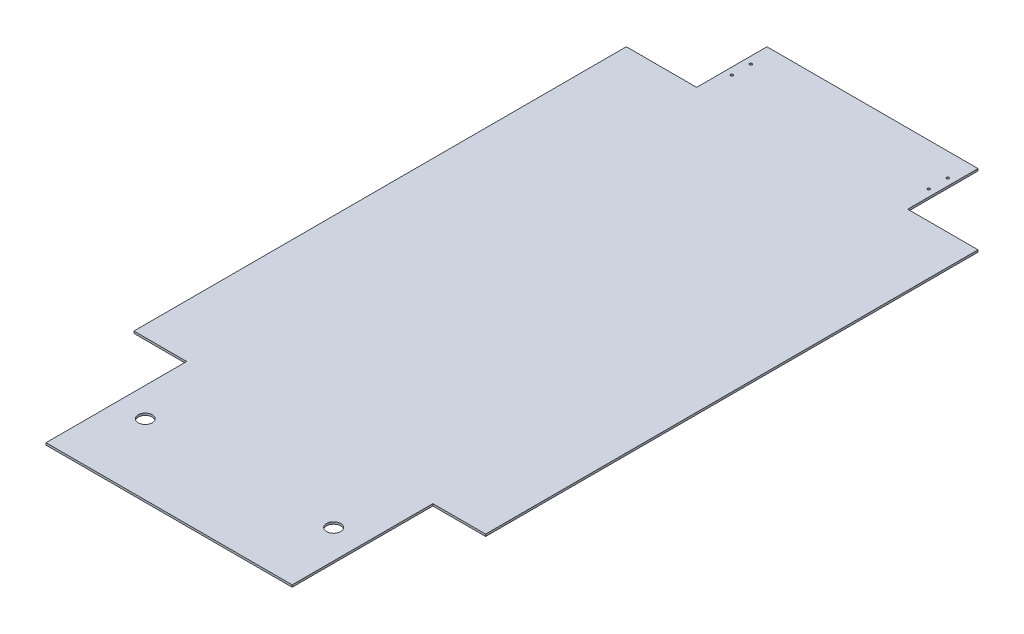
ISO-10303-21;
HEADER;
FILE_DESCRIPTION(('STEP AP214'),'2;1');
FILE_NAME('part.step','',(''),(''),'','','');
FILE_SCHEMA(('AUTOMOTIVE_DESIGN { 1 0 10303 214 1 1 1 1 }'));
ENDSEC;
DATA;
#1=APPLICATION_CONTEXT('core data for automotive mechanical design processes');
#2=APPLICATION_PROTOCOL_DEFINITION('international standard','automotive_design',2000,#1);
#3=PRODUCT_CONTEXT('',#1,'mechanical');
#4=PRODUCT('Part','Part','',(#3));
#5=PRODUCT_RELATED_PRODUCT_CATEGORY('part','',(#4));
#6=PRODUCT_DEFINITION_FORMATION('','',#4);
#7=PRODUCT_DEFINITION_CONTEXT('part definition',#1,'design');
#8=PRODUCT_DEFINITION('design','',#6,#7);
#9=PRODUCT_DEFINITION_SHAPE('','',#8);
#10=(LENGTH_UNIT() NAMED_UNIT(*) SI_UNIT(.MILLI.,.METRE.));
#11=(NAMED_UNIT(*) PLANE_ANGLE_UNIT() SI_UNIT($,.RADIAN.));
#12=(NAMED_UNIT(*) SI_UNIT($,.STERADIAN.) SOLID_ANGLE_UNIT());
#13=UNCERTAINTY_MEASURE_WITH_UNIT(LENGTH_MEASURE(1.E-05),#10,'distance_accuracy_value','');
#14=(GEOMETRIC_REPRESENTATION_CONTEXT(3) GLOBAL_UNCERTAINTY_ASSIGNED_CONTEXT((#13)) GLOBAL_UNIT_ASSIGNED_CONTEXT((#10,
#11,#12)) REPRESENTATION_CONTEXT('',''));
#15=CARTESIAN_POINT('',(0.,0.,0.));
#16=DIRECTION('',(0.,0.,1.));
#17=DIRECTION('',(1.,0.,0.));
#18=AXIS2_PLACEMENT_3D('',#15,#16,#17);
#19=CARTESIAN_POINT('',(0.,3.,0.));
#20=DIRECTION('',(0.,-1.,0.));
#21=DIRECTION('',(0.,0.,-1.));
#22=AXIS2_PLACEMENT_3D('',#19,#20,#21);
#23=PLANE('',#22);
#24=DIRECTION('',(1.,0.,0.));
#25=VECTOR('',#24,1.);
#26=CARTESIAN_POINT('',(-175.,3.,300.));
#27=LINE('',#26,#25);
#28=CARTESIAN_POINT('',(-250.,3.,300.));
#29=VERTEX_POINT('',#28);
#30=CARTESIAN_POINT('',(-175.,3.,300.));
#31=VERTEX_POINT('',#30);
#32=EDGE_CURVE('E179',#29,#31,#27,.T.);
#33=ORIENTED_EDGE('',*,*,#32,.T.);
#34=DIRECTION('',(0.,0.,1.));
#35=VECTOR('',#34,1.);
#36=CARTESIAN_POINT('',(-175.,3.,500.));
#37=LINE('',#36,#35);
#38=CARTESIAN_POINT('',(-175.,3.,500.));
#39=VERTEX_POINT('',#38);
#40=EDGE_CURVE('E107',#31,#39,#37,.T.);
#41=ORIENTED_EDGE('',*,*,#40,.T.);
#42=DIRECTION('',(1.,0.,0.));
#43=VECTOR('',#42,1.);
#44=CARTESIAN_POINT('',(175.,3.,500.));
#45=LINE('',#44,#43);
#46=CARTESIAN_POINT('',(175.,3.,500.));
#47=VERTEX_POINT('',#46);
#48=EDGE_CURVE('E206',#39,#47,#45,.T.);
#49=ORIENTED_EDGE('',*,*,#48,.T.);
#50=DIRECTION('',(0.,0.,-1.));
#51=VECTOR('',#50,1.);
#52=CARTESIAN_POINT('',(175.,3.,300.));
#53=LINE('',#52,#51);
#54=CARTESIAN_POINT('',(175.,3.,300.));
#55=VERTEX_POINT('',#54);
#56=EDGE_CURVE('E225',#47,#55,#53,.T.);
#57=ORIENTED_EDGE('',*,*,#56,.T.);
#58=DIRECTION('',(1.,0.,0.));
#59=VECTOR('',#58,1.);
#60=CARTESIAN_POINT('',(250.,3.,300.));
#61=LINE('',#60,#59);
#62=CARTESIAN_POINT('',(250.,3.,300.));
#63=VERTEX_POINT('',#62);
#64=EDGE_CURVE('E222',#55,#63,#61,.T.);
#65=ORIENTED_EDGE('',*,*,#64,.T.);
#66=DIRECTION('',(0.,0.,-1.));
#67=VECTOR('',#66,1.);
#68=CARTESIAN_POINT('',(250.,3.,-400.));
#69=LINE('',#68,#67);
#70=CARTESIAN_POINT('',(250.,3.,-400.));
#71=VERTEX_POINT('',#70);
#72=EDGE_CURVE('E224',#63,#71,#69,.T.);
#73=ORIENTED_EDGE('',*,*,#72,.T.);
#74=DIRECTION('',(-1.,0.,0.));
#75=VECTOR('',#74,1.);
#76=CARTESIAN_POINT('',(150.,3.,-400.));
#77=LINE('',#76,#75);
#78=CARTESIAN_POINT('',(150.,3.,-400.));
#79=VERTEX_POINT('',#78);
#80=EDGE_CURVE('E227',#71,#79,#77,.T.);
#81=ORIENTED_EDGE('',*,*,#80,.T.);
#82=DIRECTION('',(0.,0.,-1.));
#83=VECTOR('',#82,1.);
#84=CARTESIAN_POINT('',(150.,3.,-500.));
#85=LINE('',#84,#83);
#86=CARTESIAN_POINT('',(150.,3.,-500.));
#87=VERTEX_POINT('',#86);
#88=EDGE_CURVE('E233',#79,#87,#85,.T.);
#89=ORIENTED_EDGE('',*,*,#88,.T.);
#90=DIRECTION('',(-1.,0.,0.));
#91=VECTOR('',#90,1.);
#92=CARTESIAN_POINT('',(-150.,3.,-500.));
#93=LINE('',#92,#91);
#94=CARTESIAN_POINT('',(-150.,3.,-500.));
#95=VERTEX_POINT('',#94);
#96=EDGE_CURVE('E138',#87,#95,#93,.T.);
#97=ORIENTED_EDGE('',*,*,#96,.T.);
#98=DIRECTION('',(0.,0.,1.));
#99=VECTOR('',#98,1.);
#100=CARTESIAN_POINT('',(-150.,3.,-400.));
#101=LINE('',#100,#99);
#102=CARTESIAN_POINT('',(-150.,3.,-400.));
#103=VERTEX_POINT('',#102);
#104=EDGE_CURVE('E132',#95,#103,#101,.T.);
#105=ORIENTED_EDGE('',*,*,#104,.T.);
#106=DIRECTION('',(-1.,0.,0.));
#107=VECTOR('',#106,1.);
#108=CARTESIAN_POINT('',(-250.,3.,-400.));
#109=LINE('',#108,#107);
#110=CARTESIAN_POINT('',(-250.,3.,-400.));
#111=VERTEX_POINT('',#110);
#112=EDGE_CURVE('E136',#103,#111,#109,.T.);
#113=ORIENTED_EDGE('',*,*,#112,.T.);
#114=DIRECTION('',(0.,0.,1.));
#115=VECTOR('',#114,1.);
#116=CARTESIAN_POINT('',(-250.,3.,300.));
#117=LINE('',#116,#115);
#118=EDGE_CURVE('E52',#111,#29,#117,.T.);
#119=ORIENTED_EDGE('',*,*,#118,.T.);
#120=EDGE_LOOP('',(#33,#41,#49,#57,#65,#73,#81,#89,#97,#105,#113,#119));
#121=FACE_BOUND('',#120,.T.);
#122=CARTESIAN_POINT('',(133.9,3.,400.));
#123=DIRECTION('',(0.,1.,0.));
#124=DIRECTION('',(0.,0.,1.));
#125=AXIS2_PLACEMENT_3D('',#122,#123,#124);
#126=CIRCLE('',#125,10.);
#127=CARTESIAN_POINT('',(133.9,3.,410.));
#128=VERTEX_POINT('',#127);
#129=EDGE_CURVE('E160',#128,#128,#126,.T.);
#130=ORIENTED_EDGE('',*,*,#129,.F.);
#131=EDGE_LOOP('',(#130));
#132=FACE_BOUND('',#131,.T.);
#133=CARTESIAN_POINT('',(-133.9,3.,400.));
#134=DIRECTION('',(0.,1.,0.));
#135=DIRECTION('',(0.,0.,-1.));
#136=AXIS2_PLACEMENT_3D('',#133,#134,#135);
#137=CIRCLE('',#136,10.);
#138=CARTESIAN_POINT('',(-133.9,3.,390.));
#139=VERTEX_POINT('',#138);
#140=EDGE_CURVE('E317',#139,#139,#137,.T.);
#141=ORIENTED_EDGE('',*,*,#140,.F.);
#142=EDGE_LOOP('',(#141));
#143=FACE_BOUND('',#142,.T.);
#144=CARTESIAN_POINT('',(140.,3.,-466.9494));
#145=DIRECTION('',(0.,1.,0.));
#146=DIRECTION('',(0.,0.,1.));
#147=AXIS2_PLACEMENT_3D('',#144,#145,#146);
#148=CIRCLE('',#147,1.77800000000001);
#149=CARTESIAN_POINT('',(140.,3.,-465.1714));
#150=VERTEX_POINT('',#149);
#151=EDGE_CURVE('E311',#150,#150,#148,.T.);
#152=ORIENTED_EDGE('',*,*,#151,.F.);
#153=EDGE_LOOP('',(#152));
#154=FACE_BOUND('',#153,.T.);
#155=CARTESIAN_POINT('',(140.,3.,-440.));
#156=DIRECTION('',(0.,1.,0.));
#157=DIRECTION('',(0.,0.,1.));
#158=AXIS2_PLACEMENT_3D('',#155,#156,#157);
#159=CIRCLE('',#158,1.77800000000001);
#160=CARTESIAN_POINT('',(140.,3.,-438.222));
#161=VERTEX_POINT('',#160);
#162=EDGE_CURVE('E305',#161,#161,#159,.T.);
#163=ORIENTED_EDGE('',*,*,#162,.F.);
#164=EDGE_LOOP('',(#163));
#165=FACE_BOUND('',#164,.T.);
#166=CARTESIAN_POINT('',(-140.,3.,-466.9494));
#167=DIRECTION('',(0.,1.,0.));
#168=DIRECTION('',(0.,0.,-1.));
#169=AXIS2_PLACEMENT_3D('',#166,#167,#168);
#170=CIRCLE('',#169,1.77800000000001);
#171=CARTESIAN_POINT('',(-140.,3.,-468.7274));
#172=VERTEX_POINT('',#171);
#173=EDGE_CURVE('E299',#172,#172,#170,.T.);
#174=ORIENTED_EDGE('',*,*,#173,.F.);
#175=EDGE_LOOP('',(#174));
#176=FACE_BOUND('',#175,.T.);
#177=CARTESIAN_POINT('',(-140.,3.,-440.));
#178=DIRECTION('',(0.,1.,0.));
#179=DIRECTION('',(0.,0.,-1.));
#180=AXIS2_PLACEMENT_3D('',#177,#178,#179);
#181=CIRCLE('',#180,1.77800000000001);
#182=CARTESIAN_POINT('',(-140.,3.,-441.778));
#183=VERTEX_POINT('',#182);
#184=EDGE_CURVE('E290',#183,#183,#181,.T.);
#185=ORIENTED_EDGE('',*,*,#184,.F.);
#186=EDGE_LOOP('',(#185));
#187=FACE_BOUND('',#186,.T.);
#188=ADVANCED_FACE('F35',(#121,#132,#143,#154,#165,#176,#187),#23,.F.);
#189=CARTESIAN_POINT('',(0.,0.,0.));
#190=DIRECTION('',(0.,-1.,0.));
#191=DIRECTION('',(0.,0.,-1.));
#192=AXIS2_PLACEMENT_3D('',#189,#190,#191);
#193=PLANE('',#192);
#194=CARTESIAN_POINT('',(-140.,0.,-466.9494));
#195=DIRECTION('',(0.,1.,0.));
#196=DIRECTION('',(0.,0.,-1.));
#197=AXIS2_PLACEMENT_3D('',#194,#195,#196);
#198=CIRCLE('',#197,1.77800000000001);
#199=CARTESIAN_POINT('',(-140.,0.,-468.7274));
#200=VERTEX_POINT('',#199);
#201=EDGE_CURVE('E296',#200,#200,#198,.T.);
#202=ORIENTED_EDGE('',*,*,#201,.T.);
#203=EDGE_LOOP('',(#202));
#204=FACE_BOUND('',#203,.T.);
#205=CARTESIAN_POINT('',(140.,0.,-466.9494));
#206=DIRECTION('',(0.,1.,0.));
#207=DIRECTION('',(0.,0.,1.));
#208=AXIS2_PLACEMENT_3D('',#205,#206,#207);
#209=CIRCLE('',#208,1.77800000000001);
#210=CARTESIAN_POINT('',(140.,0.,-465.1714));
#211=VERTEX_POINT('',#210);
#212=EDGE_CURVE('E308',#211,#211,#209,.T.);
#213=ORIENTED_EDGE('',*,*,#212,.T.);
#214=EDGE_LOOP('',(#213));
#215=FACE_BOUND('',#214,.T.);
#216=CARTESIAN_POINT('',(133.9,0.,400.));
#217=DIRECTION('',(0.,1.,0.));
#218=DIRECTION('',(0.,0.,1.));
#219=AXIS2_PLACEMENT_3D('',#216,#217,#218);
#220=CIRCLE('',#219,10.);
#221=CARTESIAN_POINT('',(133.9,0.,410.));
#222=VERTEX_POINT('',#221);
#223=EDGE_CURVE('E320',#222,#222,#220,.T.);
#224=ORIENTED_EDGE('',*,*,#223,.T.);
#225=EDGE_LOOP('',(#224));
#226=FACE_BOUND('',#225,.T.);
#227=DIRECTION('',(1.,0.,0.));
#228=VECTOR('',#227,1.);
#229=CARTESIAN_POINT('',(-175.,0.,300.));
#230=LINE('',#229,#228);
#231=CARTESIAN_POINT('',(-250.,0.,300.));
#232=VERTEX_POINT('',#231);
#233=CARTESIAN_POINT('',(-175.,0.,300.));
#234=VERTEX_POINT('',#233);
#235=EDGE_CURVE('E156',#232,#234,#230,.T.);
#236=ORIENTED_EDGE('',*,*,#235,.F.);
#237=DIRECTION('',(0.,0.,1.));
#238=VECTOR('',#237,1.);
#239=CARTESIAN_POINT('',(-250.,0.,300.));
#240=LINE('',#239,#238);
#241=CARTESIAN_POINT('',(-250.,0.,-400.));
#242=VERTEX_POINT('',#241);
#243=EDGE_CURVE('E99',#242,#232,#240,.T.);
#244=ORIENTED_EDGE('',*,*,#243,.F.);
#245=DIRECTION('',(-1.,0.,0.));
#246=VECTOR('',#245,1.);
#247=CARTESIAN_POINT('',(-250.,0.,-400.));
#248=LINE('',#247,#246);
#249=CARTESIAN_POINT('',(-150.,0.,-400.));
#250=VERTEX_POINT('',#249);
#251=EDGE_CURVE('E93',#250,#242,#248,.T.);
#252=ORIENTED_EDGE('',*,*,#251,.F.);
#253=DIRECTION('',(0.,0.,1.));
#254=VECTOR('',#253,1.);
#255=CARTESIAN_POINT('',(-150.,0.,-400.));
#256=LINE('',#255,#254);
#257=CARTESIAN_POINT('',(-150.,0.,-500.));
#258=VERTEX_POINT('',#257);
#259=EDGE_CURVE('E146',#258,#250,#256,.T.);
#260=ORIENTED_EDGE('',*,*,#259,.F.);
#261=DIRECTION('',(-1.,0.,0.));
#262=VECTOR('',#261,1.);
#263=CARTESIAN_POINT('',(-150.,0.,-500.));
#264=LINE('',#263,#262);
#265=CARTESIAN_POINT('',(150.,0.,-500.));
#266=VERTEX_POINT('',#265);
#267=EDGE_CURVE('E174',#266,#258,#264,.T.);
#268=ORIENTED_EDGE('',*,*,#267,.F.);
#269=DIRECTION('',(0.,0.,-1.));
#270=VECTOR('',#269,1.);
#271=CARTESIAN_POINT('',(150.,0.,-500.));
#272=LINE('',#271,#270);
#273=CARTESIAN_POINT('',(150.,0.,-400.));
#274=VERTEX_POINT('',#273);
#275=EDGE_CURVE('E172',#274,#266,#272,.T.);
#276=ORIENTED_EDGE('',*,*,#275,.F.);
#277=DIRECTION('',(-1.,0.,0.));
#278=VECTOR('',#277,1.);
#279=CARTESIAN_POINT('',(150.,0.,-400.));
#280=LINE('',#279,#278);
#281=CARTESIAN_POINT('',(250.,0.,-400.));
#282=VERTEX_POINT('',#281);
#283=EDGE_CURVE('E170',#282,#274,#280,.T.);
#284=ORIENTED_EDGE('',*,*,#283,.F.);
#285=DIRECTION('',(0.,0.,-1.));
#286=VECTOR('',#285,1.);
#287=CARTESIAN_POINT('',(250.,0.,-400.));
#288=LINE('',#287,#286);
#289=CARTESIAN_POINT('',(250.,0.,300.));
#290=VERTEX_POINT('',#289);
#291=EDGE_CURVE('E168',#290,#282,#288,.T.);
#292=ORIENTED_EDGE('',*,*,#291,.F.);
#293=DIRECTION('',(1.,0.,0.));
#294=VECTOR('',#293,1.);
#295=CARTESIAN_POINT('',(250.,0.,300.));
#296=LINE('',#295,#294);
#297=CARTESIAN_POINT('',(175.,0.,300.));
#298=VERTEX_POINT('',#297);
#299=EDGE_CURVE('E166',#298,#290,#296,.T.);
#300=ORIENTED_EDGE('',*,*,#299,.F.);
#301=DIRECTION('',(0.,0.,-1.));
#302=VECTOR('',#301,1.);
#303=CARTESIAN_POINT('',(175.,0.,300.));
#304=LINE('',#303,#302);
#305=CARTESIAN_POINT('',(175.,0.,500.));
#306=VERTEX_POINT('',#305);
#307=EDGE_CURVE('E164',#306,#298,#304,.T.);
#308=ORIENTED_EDGE('',*,*,#307,.F.);
#309=DIRECTION('',(1.,0.,0.));
#310=VECTOR('',#309,1.);
#311=CARTESIAN_POINT('',(175.,0.,500.));
#312=LINE('',#311,#310);
#313=CARTESIAN_POINT('',(-175.,0.,500.));
#314=VERTEX_POINT('',#313);
#315=EDGE_CURVE('E162',#314,#306,#312,.T.);
#316=ORIENTED_EDGE('',*,*,#315,.F.);
#317=DIRECTION('',(0.,0.,1.));
#318=VECTOR('',#317,1.);
#319=CARTESIAN_POINT('',(-175.,0.,500.));
#320=LINE('',#319,#318);
#321=EDGE_CURVE('E159',#234,#314,#320,.T.);
#322=ORIENTED_EDGE('',*,*,#321,.F.);
#323=EDGE_LOOP('',(#236,#244,#252,#260,#268,#276,#284,#292,#300,#308,#316,#322));
#324=FACE_BOUND('',#323,.T.);
#325=CARTESIAN_POINT('',(-133.9,0.,400.));
#326=DIRECTION('',(0.,1.,0.));
#327=DIRECTION('',(0.,0.,-1.));
#328=AXIS2_PLACEMENT_3D('',#325,#326,#327);
#329=CIRCLE('',#328,10.);
#330=CARTESIAN_POINT('',(-133.9,0.,390.));
#331=VERTEX_POINT('',#330);
#332=EDGE_CURVE('E314',#331,#331,#329,.T.);
#333=ORIENTED_EDGE('',*,*,#332,.T.);
#334=EDGE_LOOP('',(#333));
#335=FACE_BOUND('',#334,.T.);
#336=CARTESIAN_POINT('',(140.,0.,-440.));
#337=DIRECTION('',(0.,1.,0.));
#338=DIRECTION('',(0.,0.,1.));
#339=AXIS2_PLACEMENT_3D('',#336,#337,#338);
#340=CIRCLE('',#339,1.77800000000001);
#341=CARTESIAN_POINT('',(140.,0.,-438.222));
#342=VERTEX_POINT('',#341);
#343=EDGE_CURVE('E302',#342,#342,#340,.T.);
#344=ORIENTED_EDGE('',*,*,#343,.T.);
#345=EDGE_LOOP('',(#344));
#346=FACE_BOUND('',#345,.T.);
#347=CARTESIAN_POINT('',(-140.,0.,-440.));
#348=DIRECTION('',(0.,1.,0.));
#349=DIRECTION('',(0.,0.,-1.));
#350=AXIS2_PLACEMENT_3D('',#347,#348,#349);
#351=CIRCLE('',#350,1.77800000000001);
#352=CARTESIAN_POINT('',(-140.,0.,-441.778));
#353=VERTEX_POINT('',#352);
#354=EDGE_CURVE('E293',#353,#353,#351,.T.);
#355=ORIENTED_EDGE('',*,*,#354,.T.);
#356=EDGE_LOOP('',(#355));
#357=FACE_BOUND('',#356,.T.);
#358=ADVANCED_FACE('F210',(#204,#215,#226,#324,#335,#346,#357),#193,.T.);
#359=CARTESIAN_POINT('',(-175.,3.,300.));
#360=DIRECTION('',(0.,0.,-1.));
#361=DIRECTION('',(-1.,0.,0.));
#362=AXIS2_PLACEMENT_3D('',#359,#360,#361);
#363=PLANE('',#362);
#364=ORIENTED_EDGE('',*,*,#235,.T.);
#365=DIRECTION('',(0.,-1.,0.));
#366=VECTOR('',#365,1.);
#367=CARTESIAN_POINT('',(-175.,3.,300.));
#368=LINE('',#367,#366);
#369=EDGE_CURVE('E11',#31,#234,#368,.T.);
#370=ORIENTED_EDGE('',*,*,#369,.F.);
#371=ORIENTED_EDGE('',*,*,#32,.F.);
#372=DIRECTION('',(0.,-1.,0.));
#373=VECTOR('',#372,1.);
#374=CARTESIAN_POINT('',(-250.,3.,300.));
#375=LINE('',#374,#373);
#376=EDGE_CURVE('E152',#29,#232,#375,.T.);
#377=ORIENTED_EDGE('',*,*,#376,.T.);
#378=EDGE_LOOP('',(#364,#370,#371,#377));
#379=FACE_BOUND('',#378,.T.);
#380=ADVANCED_FACE('F37',(#379),#363,.F.);
#381=CARTESIAN_POINT('',(-175.,3.,500.));
#382=DIRECTION('',(1.,0.,0.));
#383=DIRECTION('',(0.,0.,-1.));
#384=AXIS2_PLACEMENT_3D('',#381,#382,#383);
#385=PLANE('',#384);
#386=ORIENTED_EDGE('',*,*,#321,.T.);
#387=DIRECTION('',(0.,-1.,0.));
#388=VECTOR('',#387,1.);
#389=CARTESIAN_POINT('',(-175.,3.,500.));
#390=LINE('',#389,#388);
#391=EDGE_CURVE('E44',#39,#314,#390,.T.);
#392=ORIENTED_EDGE('',*,*,#391,.F.);
#393=ORIENTED_EDGE('',*,*,#40,.F.);
#394=ORIENTED_EDGE('',*,*,#369,.T.);
#395=EDGE_LOOP('',(#386,#392,#393,#394));
#396=FACE_BOUND('',#395,.T.);
#397=ADVANCED_FACE('F450',(#396),#385,.F.);
#398=CARTESIAN_POINT('',(175.,3.,500.));
#399=DIRECTION('',(0.,0.,-1.));
#400=DIRECTION('',(-1.,0.,0.));
#401=AXIS2_PLACEMENT_3D('',#398,#399,#400);
#402=PLANE('',#401);
#403=ORIENTED_EDGE('',*,*,#315,.T.);
#404=DIRECTION('',(0.,-1.,0.));
#405=VECTOR('',#404,1.);
#406=CARTESIAN_POINT('',(175.,3.,500.));
#407=LINE('',#406,#405);
#408=EDGE_CURVE('E198',#47,#306,#407,.T.);
#409=ORIENTED_EDGE('',*,*,#408,.F.);
#410=ORIENTED_EDGE('',*,*,#48,.F.);
#411=ORIENTED_EDGE('',*,*,#391,.T.);
#412=EDGE_LOOP('',(#403,#409,#410,#411));
#413=FACE_BOUND('',#412,.T.);
#414=ADVANCED_FACE('F204',(#413),#402,.F.);
#415=CARTESIAN_POINT('',(175.,3.,300.));
#416=DIRECTION('',(-1.,0.,0.));
#417=DIRECTION('',(0.,0.,1.));
#418=AXIS2_PLACEMENT_3D('',#415,#416,#417);
#419=PLANE('',#418);
#420=ORIENTED_EDGE('',*,*,#307,.T.);
#421=DIRECTION('',(0.,-1.,0.));
#422=VECTOR('',#421,1.);
#423=CARTESIAN_POINT('',(175.,3.,300.));
#424=LINE('',#423,#422);
#425=EDGE_CURVE('E195',#55,#298,#424,.T.);
#426=ORIENTED_EDGE('',*,*,#425,.F.);
#427=ORIENTED_EDGE('',*,*,#56,.F.);
#428=ORIENTED_EDGE('',*,*,#408,.T.);
#429=EDGE_LOOP('',(#420,#426,#427,#428));
#430=FACE_BOUND('',#429,.T.);
#431=ADVANCED_FACE('F216',(#430),#419,.F.);
#432=CARTESIAN_POINT('',(250.,3.,300.));
#433=DIRECTION('',(0.,0.,-1.));
#434=DIRECTION('',(-1.,0.,0.));
#435=AXIS2_PLACEMENT_3D('',#432,#433,#434);
#436=PLANE('',#435);
#437=ORIENTED_EDGE('',*,*,#299,.T.);
#438=DIRECTION('',(0.,-1.,0.));
#439=VECTOR('',#438,1.);
#440=CARTESIAN_POINT('',(250.,3.,300.));
#441=LINE('',#440,#439);
#442=EDGE_CURVE('E192',#63,#290,#441,.T.);
#443=ORIENTED_EDGE('',*,*,#442,.F.);
#444=ORIENTED_EDGE('',*,*,#64,.F.);
#445=ORIENTED_EDGE('',*,*,#425,.T.);
#446=EDGE_LOOP('',(#437,#443,#444,#445));
#447=FACE_BOUND('',#446,.T.);
#448=ADVANCED_FACE('F220',(#447),#436,.F.);
#449=CARTESIAN_POINT('',(250.,3.,-400.));
#450=DIRECTION('',(-1.,0.,0.));
#451=DIRECTION('',(0.,0.,1.));
#452=AXIS2_PLACEMENT_3D('',#449,#450,#451);
#453=PLANE('',#452);
#454=ORIENTED_EDGE('',*,*,#291,.T.);
#455=DIRECTION('',(0.,-1.,0.));
#456=VECTOR('',#455,1.);
#457=CARTESIAN_POINT('',(250.,3.,-400.));
#458=LINE('',#457,#456);
#459=EDGE_CURVE('E189',#71,#282,#458,.T.);
#460=ORIENTED_EDGE('',*,*,#459,.F.);
#461=ORIENTED_EDGE('',*,*,#72,.F.);
#462=ORIENTED_EDGE('',*,*,#442,.T.);
#463=EDGE_LOOP('',(#454,#460,#461,#462));
#464=FACE_BOUND('',#463,.T.);
#465=ADVANCED_FACE('F415',(#464),#453,.F.);
#466=CARTESIAN_POINT('',(150.,3.,-400.));
#467=DIRECTION('',(0.,0.,1.));
#468=DIRECTION('',(1.,0.,0.));
#469=AXIS2_PLACEMENT_3D('',#466,#467,#468);
#470=PLANE('',#469);
#471=ORIENTED_EDGE('',*,*,#283,.T.);
#472=DIRECTION('',(0.,-1.,0.));
#473=VECTOR('',#472,1.);
#474=CARTESIAN_POINT('',(150.,3.,-400.));
#475=LINE('',#474,#473);
#476=EDGE_CURVE('E186',#79,#274,#475,.T.);
#477=ORIENTED_EDGE('',*,*,#476,.F.);
#478=ORIENTED_EDGE('',*,*,#80,.F.);
#479=ORIENTED_EDGE('',*,*,#459,.T.);
#480=EDGE_LOOP('',(#471,#477,#478,#479));
#481=FACE_BOUND('',#480,.T.);
#482=ADVANCED_FACE('F406',(#481),#470,.F.);
#483=CARTESIAN_POINT('',(150.,3.,-500.));
#484=DIRECTION('',(-1.,0.,0.));
#485=DIRECTION('',(0.,0.,1.));
#486=AXIS2_PLACEMENT_3D('',#483,#484,#485);
#487=PLANE('',#486);
#488=ORIENTED_EDGE('',*,*,#275,.T.);
#489=DIRECTION('',(0.,-1.,0.));
#490=VECTOR('',#489,1.);
#491=CARTESIAN_POINT('',(150.,3.,-500.));
#492=LINE('',#491,#490);
#493=EDGE_CURVE('E183',#87,#266,#492,.T.);
#494=ORIENTED_EDGE('',*,*,#493,.F.);
#495=ORIENTED_EDGE('',*,*,#88,.F.);
#496=ORIENTED_EDGE('',*,*,#476,.T.);
#497=EDGE_LOOP('',(#488,#494,#495,#496));
#498=FACE_BOUND('',#497,.T.);
#499=ADVANCED_FACE('F239',(#498),#487,.F.);
#500=CARTESIAN_POINT('',(-150.,3.,-500.));
#501=DIRECTION('',(0.,0.,1.));
#502=DIRECTION('',(1.,0.,0.));
#503=AXIS2_PLACEMENT_3D('',#500,#501,#502);
#504=PLANE('',#503);
#505=ORIENTED_EDGE('',*,*,#267,.T.);
#506=DIRECTION('',(0.,-1.,0.));
#507=VECTOR('',#506,1.);
#508=CARTESIAN_POINT('',(-150.,3.,-500.));
#509=LINE('',#508,#507);
#510=EDGE_CURVE('E147',#95,#258,#509,.T.);
#511=ORIENTED_EDGE('',*,*,#510,.F.);
#512=ORIENTED_EDGE('',*,*,#96,.F.);
#513=ORIENTED_EDGE('',*,*,#493,.T.);
#514=EDGE_LOOP('',(#505,#511,#512,#513));
#515=FACE_BOUND('',#514,.T.);
#516=ADVANCED_FACE('F243',(#515),#504,.F.);
#517=CARTESIAN_POINT('',(-150.,3.,-400.));
#518=DIRECTION('',(1.,0.,0.));
#519=DIRECTION('',(0.,0.,-1.));
#520=AXIS2_PLACEMENT_3D('',#517,#518,#519);
#521=PLANE('',#520);
#522=ORIENTED_EDGE('',*,*,#259,.T.);
#523=DIRECTION('',(0.,-1.,0.));
#524=VECTOR('',#523,1.);
#525=CARTESIAN_POINT('',(-150.,3.,-400.));
#526=LINE('',#525,#524);
#527=EDGE_CURVE('E143',#103,#250,#526,.T.);
#528=ORIENTED_EDGE('',*,*,#527,.F.);
#529=ORIENTED_EDGE('',*,*,#104,.F.);
#530=ORIENTED_EDGE('',*,*,#510,.T.);
#531=EDGE_LOOP('',(#522,#528,#529,#530));
#532=FACE_BOUND('',#531,.T.);
#533=ADVANCED_FACE('F144',(#532),#521,.F.);
#534=CARTESIAN_POINT('',(-250.,3.,-400.));
#535=DIRECTION('',(0.,0.,1.));
#536=DIRECTION('',(1.,0.,0.));
#537=AXIS2_PLACEMENT_3D('',#534,#535,#536);
#538=PLANE('',#537);
#539=ORIENTED_EDGE('',*,*,#251,.T.);
#540=DIRECTION('',(0.,-1.,0.));
#541=VECTOR('',#540,1.);
#542=CARTESIAN_POINT('',(-250.,3.,-400.));
#543=LINE('',#542,#541);
#544=EDGE_CURVE('E148',#111,#242,#543,.T.);
#545=ORIENTED_EDGE('',*,*,#544,.F.);
#546=ORIENTED_EDGE('',*,*,#112,.F.);
#547=ORIENTED_EDGE('',*,*,#527,.T.);
#548=EDGE_LOOP('',(#539,#545,#546,#547));
#549=FACE_BOUND('',#548,.T.);
#550=ADVANCED_FACE('F150',(#549),#538,.F.);
#551=CARTESIAN_POINT('',(-250.,3.,300.));
#552=DIRECTION('',(1.,0.,0.));
#553=DIRECTION('',(0.,0.,-1.));
#554=AXIS2_PLACEMENT_3D('',#551,#552,#553);
#555=PLANE('',#554);
#556=ORIENTED_EDGE('',*,*,#243,.T.);
#557=ORIENTED_EDGE('',*,*,#376,.F.);
#558=ORIENTED_EDGE('',*,*,#118,.F.);
#559=ORIENTED_EDGE('',*,*,#544,.T.);
#560=EDGE_LOOP('',(#556,#557,#558,#559));
#561=FACE_BOUND('',#560,.T.);
#562=ADVANCED_FACE('F247',(#561),#555,.F.);
#563=CARTESIAN_POINT('',(133.9,3.,400.));
#564=DIRECTION('',(0.,-1.,0.));
#565=DIRECTION('',(0.,0.,-1.));
#566=AXIS2_PLACEMENT_3D('',#563,#564,#565);
#567=CYLINDRICAL_SURFACE('',#566,10.);
#568=ORIENTED_EDGE('',*,*,#129,.T.);
#569=EDGE_LOOP('',(#568));
#570=FACE_BOUND('',#569,.T.);
#571=ORIENTED_EDGE('',*,*,#223,.F.);
#572=EDGE_LOOP('',(#571));
#573=FACE_BOUND('',#572,.T.);
#574=ADVANCED_FACE('F249',(#570,#573),#567,.F.);
#575=CARTESIAN_POINT('',(-133.9,3.,400.));
#576=DIRECTION('',(0.,-1.,0.));
#577=DIRECTION('',(0.,0.,-1.));
#578=AXIS2_PLACEMENT_3D('',#575,#576,#577);
#579=CYLINDRICAL_SURFACE('',#578,10.);
#580=ORIENTED_EDGE('',*,*,#140,.T.);
#581=EDGE_LOOP('',(#580));
#582=FACE_BOUND('',#581,.T.);
#583=ORIENTED_EDGE('',*,*,#332,.F.);
#584=EDGE_LOOP('',(#583));
#585=FACE_BOUND('',#584,.T.);
#586=ADVANCED_FACE('F255',(#582,#585),#579,.F.);
#587=CARTESIAN_POINT('',(140.,3.,-466.9494));
#588=DIRECTION('',(0.,-1.,0.));
#589=DIRECTION('',(0.,0.,-1.));
#590=AXIS2_PLACEMENT_3D('',#587,#588,#589);
#591=CYLINDRICAL_SURFACE('',#590,1.77800000000001);
#592=ORIENTED_EDGE('',*,*,#151,.T.);
#593=EDGE_LOOP('',(#592));
#594=FACE_BOUND('',#593,.T.);
#595=ORIENTED_EDGE('',*,*,#212,.F.);
#596=EDGE_LOOP('',(#595));
#597=FACE_BOUND('',#596,.T.);
#598=ADVANCED_FACE('F269',(#594,#597),#591,.F.);
#599=CARTESIAN_POINT('',(140.,3.,-440.));
#600=DIRECTION('',(0.,-1.,0.));
#601=DIRECTION('',(0.,0.,-1.));
#602=AXIS2_PLACEMENT_3D('',#599,#600,#601);
#603=CYLINDRICAL_SURFACE('',#602,1.77800000000001);
#604=ORIENTED_EDGE('',*,*,#162,.T.);
#605=EDGE_LOOP('',(#604));
#606=FACE_BOUND('',#605,.T.);
#607=ORIENTED_EDGE('',*,*,#343,.F.);
#608=EDGE_LOOP('',(#607));
#609=FACE_BOUND('',#608,.T.);
#610=ADVANCED_FACE('F273',(#606,#609),#603,.F.);
#611=CARTESIAN_POINT('',(-140.,3.,-466.9494));
#612=DIRECTION('',(0.,-1.,0.));
#613=DIRECTION('',(0.,0.,-1.));
#614=AXIS2_PLACEMENT_3D('',#611,#612,#613);
#615=CYLINDRICAL_SURFACE('',#614,1.77800000000001);
#616=ORIENTED_EDGE('',*,*,#173,.T.);
#617=EDGE_LOOP('',(#616));
#618=FACE_BOUND('',#617,.T.);
#619=ORIENTED_EDGE('',*,*,#201,.F.);
#620=EDGE_LOOP('',(#619));
#621=FACE_BOUND('',#620,.T.);
#622=ADVANCED_FACE('F277',(#618,#621),#615,.F.);
#623=CARTESIAN_POINT('',(-140.,3.,-440.));
#624=DIRECTION('',(0.,-1.,0.));
#625=DIRECTION('',(0.,0.,-1.));
#626=AXIS2_PLACEMENT_3D('',#623,#624,#625);
#627=CYLINDRICAL_SURFACE('',#626,1.77800000000001);
#628=ORIENTED_EDGE('',*,*,#184,.T.);
#629=EDGE_LOOP('',(#628));
#630=FACE_BOUND('',#629,.T.);
#631=ORIENTED_EDGE('',*,*,#354,.F.);
#632=EDGE_LOOP('',(#631));
#633=FACE_BOUND('',#632,.T.);
#634=ADVANCED_FACE('F281',(#630,#633),#627,.F.);
#635=CLOSED_SHELL('',(#188,#358,#380,#397,#414,#431,#448,#465,#482,#499,#516,#533,#550,#562,
#574,#586,#598,#610,#622,#634));
#636=MANIFOLD_SOLID_BREP('B2',#635);
#637=ADVANCED_BREP_SHAPE_REPRESENTATION('',(#18,#636),#14);
#638=SHAPE_DEFINITION_REPRESENTATION(#9,#637);
ENDSEC;
END-ISO-10303-21;
